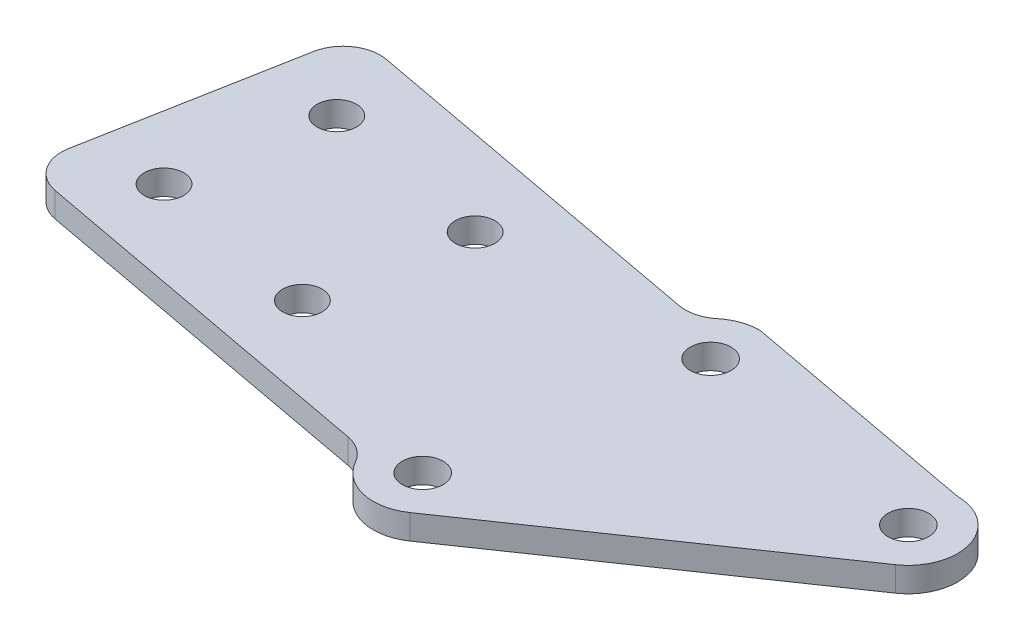
ISO-10303-21;
HEADER;
FILE_DESCRIPTION(('STEP AP214'),'2;1');
FILE_NAME('part.step','',(''),(''),'','','');
FILE_SCHEMA(('AUTOMOTIVE_DESIGN { 1 0 10303 214 1 1 1 1 }'));
ENDSEC;
DATA;
#1=APPLICATION_CONTEXT('core data for automotive mechanical design processes');
#2=APPLICATION_PROTOCOL_DEFINITION('international standard','automotive_design',2000,#1);
#3=PRODUCT_CONTEXT('',#1,'mechanical');
#4=PRODUCT('Part','Part','',(#3));
#5=PRODUCT_RELATED_PRODUCT_CATEGORY('part','',(#4));
#6=PRODUCT_DEFINITION_FORMATION('','',#4);
#7=PRODUCT_DEFINITION_CONTEXT('part definition',#1,'design');
#8=PRODUCT_DEFINITION('design','',#6,#7);
#9=PRODUCT_DEFINITION_SHAPE('','',#8);
#10=(LENGTH_UNIT() NAMED_UNIT(*) SI_UNIT(.MILLI.,.METRE.));
#11=(NAMED_UNIT(*) PLANE_ANGLE_UNIT() SI_UNIT($,.RADIAN.));
#12=(NAMED_UNIT(*) SI_UNIT($,.STERADIAN.) SOLID_ANGLE_UNIT());
#13=UNCERTAINTY_MEASURE_WITH_UNIT(LENGTH_MEASURE(1.E-05),#10,'distance_accuracy_value','');
#14=(GEOMETRIC_REPRESENTATION_CONTEXT(3) GLOBAL_UNCERTAINTY_ASSIGNED_CONTEXT((#13)) GLOBAL_UNIT_ASSIGNED_CONTEXT((#10,
#11,#12)) REPRESENTATION_CONTEXT('',''));
#15=CARTESIAN_POINT('',(0.,0.,0.));
#16=DIRECTION('',(0.,0.,1.));
#17=DIRECTION('',(1.,0.,0.));
#18=AXIS2_PLACEMENT_3D('',#15,#16,#17);
#19=CARTESIAN_POINT('',(-66.4058496105396,1.,-63.3759922013941));
#20=DIRECTION('',(0.,-1.,0.));
#21=DIRECTION('',(0.,0.,-1.));
#22=AXIS2_PLACEMENT_3D('',#19,#20,#21);
#23=PLANE('',#22);
#24=CARTESIAN_POINT('',(-91.0419653587709,1.,-76.6009698482448));
#25=DIRECTION('',(0.,1.,0.));
#26=DIRECTION('',(0.,0.,1.));
#27=AXIS2_PLACEMENT_3D('',#24,#25,#26);
#28=CIRCLE('',#27,1.60000000000001);
#29=CARTESIAN_POINT('',(-91.0419653587709,1.,-75.0009698482448));
#30=VERTEX_POINT('',#29);
#31=EDGE_CURVE('E350',#30,#30,#28,.T.);
#32=ORIENTED_EDGE('',*,*,#31,.F.);
#33=EDGE_LOOP('',(#32));
#34=FACE_BOUND('',#33,.T.);
#35=CARTESIAN_POINT('',(-75.084729666299,1.,-85.8403761633687));
#36=DIRECTION('',(0.,1.,0.));
#37=DIRECTION('',(0.,0.,1.));
#38=AXIS2_PLACEMENT_3D('',#35,#36,#37);
#39=CIRCLE('',#38,1.60000000000001);
#40=CARTESIAN_POINT('',(-75.084729666299,1.,-84.2403761633687));
#41=VERTEX_POINT('',#40);
#42=EDGE_CURVE('E342',#41,#41,#39,.T.);
#43=ORIENTED_EDGE('',*,*,#42,.F.);
#44=EDGE_LOOP('',(#43));
#45=FACE_BOUND('',#44,.T.);
#46=CARTESIAN_POINT('',(-77.2777346038908,1.,-74.0424640877641));
#47=DIRECTION('',(0.,1.,0.));
#48=DIRECTION('',(0.,0.,1.));
#49=AXIS2_PLACEMENT_3D('',#46,#47,#48);
#50=CIRCLE('',#49,1.60000000000001);
#51=CARTESIAN_POINT('',(-77.2777346038908,1.,-72.4424640877641));
#52=VERTEX_POINT('',#51);
#53=EDGE_CURVE('E337',#52,#52,#50,.T.);
#54=ORIENTED_EDGE('',*,*,#53,.F.);
#55=EDGE_LOOP('',(#54));
#56=FACE_BOUND('',#55,.T.);
#57=CARTESIAN_POINT('',(-88.8489604211791,1.,-88.3988819238494));
#58=DIRECTION('',(0.,1.,0.));
#59=DIRECTION('',(0.,0.,1.));
#60=AXIS2_PLACEMENT_3D('',#57,#58,#59);
#61=CIRCLE('',#60,1.60000000000001);
#62=CARTESIAN_POINT('',(-88.8489604211791,1.,-86.7988819238494));
#63=VERTEX_POINT('',#62);
#64=EDGE_CURVE('E349',#63,#63,#61,.T.);
#65=ORIENTED_EDGE('',*,*,#64,.F.);
#66=EDGE_LOOP('',(#65));
#67=FACE_BOUND('',#66,.T.);
#68=CARTESIAN_POINT('',(-66.4058496105396,1.,-63.3759922013941));
#69=DIRECTION('',(0.,-1.,0.));
#70=DIRECTION('',(0.,0.,-1.));
#71=AXIS2_PLACEMENT_3D('',#68,#69,#70);
#72=CIRCLE('',#71,2.99999999999999);
#73=CARTESIAN_POINT('',(-65.8575983761425,1.,-66.3254702202954));
#74=VERTEX_POINT('',#73);
#75=CARTESIAN_POINT('',(-63.7941432603428,1.,-64.852132418426));
#76=VERTEX_POINT('',#75);
#77=EDGE_CURVE('E200',#74,#76,#72,.T.);
#78=ORIENTED_EDGE('',*,*,#77,.T.);
#79=CARTESIAN_POINT('',(-60.311868126746,1.,-66.8203193744716));
#80=DIRECTION('',(0.,1.,0.));
#81=DIRECTION('',(0.,0.,1.));
#82=AXIS2_PLACEMENT_3D('',#79,#80,#81);
#83=CIRCLE('',#82,4.00000000000181);
#84=CARTESIAN_POINT('',(-58.0479698034256,1.,-63.5226286094537));
#85=VERTEX_POINT('',#84);
#86=EDGE_CURVE('E112',#76,#85,#83,.T.);
#87=ORIENTED_EDGE('',*,*,#86,.T.);
#88=DIRECTION('',(0.824422691253763,0.,-0.565974580830183));
#89=VECTOR('',#88,1.);
#90=CARTESIAN_POINT('',(-34.7297747814422,1.,-79.5308071728227));
#91=LINE('',#90,#89);
#92=CARTESIAN_POINT('',(-34.7297747814432,1.,-79.5308071728242));
#93=VERTEX_POINT('',#92);
#94=EDGE_CURVE('E237',#85,#93,#91,.T.);
#95=ORIENTED_EDGE('',*,*,#94,.T.);
#96=CARTESIAN_POINT('',(-36.9936731047651,1.,-82.8284979378391));
#97=DIRECTION('',(0.,1.,0.));
#98=DIRECTION('',(0.,0.,1.));
#99=AXIS2_PLACEMENT_3D('',#96,#97,#98);
#100=CIRCLE('',#99,4.00000000000059);
#101=CARTESIAN_POINT('',(-36.9936731047627,1.,-86.828497937838));
#102=VERTEX_POINT('',#101);
#103=EDGE_CURVE('E257',#93,#102,#100,.T.);
#104=ORIENTED_EDGE('',*,*,#103,.T.);
#105=DIRECTION('',(-0.983159339633897,0.,-0.182750411465037));
#106=VECTOR('',#105,1.);
#107=CARTESIAN_POINT('',(-56.6568598974467,1.,-90.4835061671398));
#108=LINE('',#107,#106);
#109=CARTESIAN_POINT('',(-56.6568598974467,1.,-90.4835061671404));
#110=VERTEX_POINT('',#109);
#111=EDGE_CURVE('E253',#102,#110,#108,.T.);
#112=ORIENTED_EDGE('',*,*,#111,.T.);
#113=CARTESIAN_POINT('',(-56.6568598974491,1.,-86.483506167141));
#114=DIRECTION('',(0.,1.,0.));
#115=DIRECTION('',(0.,0.,1.));
#116=AXIS2_PLACEMENT_3D('',#113,#114,#115);
#117=CIRCLE('',#116,3.99999999999942);
#118=CARTESIAN_POINT('',(-59.199275821622,1.,-89.5715672527596));
#119=VERTEX_POINT('',#118);
#120=EDGE_CURVE('E256',#110,#119,#117,.T.);
#121=ORIENTED_EDGE('',*,*,#120,.T.);
#122=CARTESIAN_POINT('',(-61.1060877647516,1.,-91.8876130669736));
#123=DIRECTION('',(0.,-1.,0.));
#124=DIRECTION('',(0.,0.,-1.));
#125=AXIS2_PLACEMENT_3D('',#122,#123,#124);
#126=CIRCLE('',#125,3.);
#127=CARTESIAN_POINT('',(-61.6543389991496,1.,-88.9381350480725));
#128=VERTEX_POINT('',#127);
#129=EDGE_CURVE('E261',#119,#128,#126,.T.);
#130=ORIENTED_EDGE('',*,*,#129,.T.);
#131=DIRECTION('',(-0.983159339633721,0.,-0.182750411465984));
#132=VECTOR('',#131,1.);
#133=CARTESIAN_POINT('',(-61.6543389991496,1.,-88.9381350480725));
#134=LINE('',#133,#132);
#135=CARTESIAN_POINT('',(-90.7933111770094,1.,-94.3545095262756));
#136=VERTEX_POINT('',#135);
#137=EDGE_CURVE('E268',#128,#136,#134,.T.);
#138=ORIENTED_EDGE('',*,*,#137,.T.);
#139=CARTESIAN_POINT('',(-91.3415624114074,1.,-91.4050315073738));
#140=DIRECTION('',(0.,1.,0.));
#141=DIRECTION('',(0.,0.,1.));
#142=AXIS2_PLACEMENT_3D('',#139,#140,#141);
#143=CIRCLE('',#142,3.00000000000065);
#144=CARTESIAN_POINT('',(-94.2910404303084,1.,-91.953282741773));
#145=VERTEX_POINT('',#144);
#146=EDGE_CURVE('E143',#136,#145,#143,.T.);
#147=ORIENTED_EDGE('',*,*,#146,.T.);
#148=DIRECTION('',(-0.182750411465984,0.,0.983159339633721));
#149=VECTOR('',#148,1.);
#150=CARTESIAN_POINT('',(-94.2910404303084,1.,-91.953282741773));
#151=LINE('',#150,#149);
#152=CARTESIAN_POINT('',(-97.3977974252462,1.,-75.2395739679132));
#153=VERTEX_POINT('',#152);
#154=EDGE_CURVE('E137',#145,#153,#151,.T.);
#155=ORIENTED_EDGE('',*,*,#154,.T.);
#156=CARTESIAN_POINT('',(-94.448319406345,1.,-74.6913227335152));
#157=DIRECTION('',(0.,1.,0.));
#158=DIRECTION('',(0.,0.,-1.));
#159=AXIS2_PLACEMENT_3D('',#156,#157,#158);
#160=CIRCLE('',#159,3.);
#161=CARTESIAN_POINT('',(-94.9965706407421,1.,-71.7418447146139));
#162=VERTEX_POINT('',#161);
#163=EDGE_CURVE('E141',#153,#162,#160,.T.);
#164=ORIENTED_EDGE('',*,*,#163,.T.);
#165=DIRECTION('',(0.983159339633772,0.,0.182750411465706));
#166=VECTOR('',#165,1.);
#167=CARTESIAN_POINT('',(-65.8575983761425,1.,-66.3254702202954));
#168=LINE('',#167,#166);
#169=EDGE_CURVE('E57',#162,#74,#168,.T.);
#170=ORIENTED_EDGE('',*,*,#169,.T.);
#171=EDGE_LOOP('',(#78,#87,#95,#104,#112,#121,#130,#138,#147,#155,#164,#170));
#172=FACE_BOUND('',#171,.T.);
#173=CARTESIAN_POINT('',(-56.6568598974491,1.,-86.483506167141));
#174=DIRECTION('',(0.,1.,0.));
#175=DIRECTION('',(0.,0.,1.));
#176=AXIS2_PLACEMENT_3D('',#173,#174,#175);
#177=CIRCLE('',#176,1.65000000726234);
#178=CARTESIAN_POINT('',(-56.6568598974491,1.,-84.8335061598787));
#179=VERTEX_POINT('',#178);
#180=EDGE_CURVE('E170',#179,#179,#177,.T.);
#181=ORIENTED_EDGE('',*,*,#180,.F.);
#182=EDGE_LOOP('',(#181));
#183=FACE_BOUND('',#182,.T.);
#184=CARTESIAN_POINT('',(-36.9936731047651,1.,-82.8284979378391));
#185=DIRECTION('',(0.,1.,0.));
#186=DIRECTION('',(0.,0.,1.));
#187=AXIS2_PLACEMENT_3D('',#184,#185,#186);
#188=CIRCLE('',#187,1.65000000727592);
#189=CARTESIAN_POINT('',(-36.9936731047651,1.,-81.1784979305632));
#190=VERTEX_POINT('',#189);
#191=EDGE_CURVE('E377',#190,#190,#188,.T.);
#192=ORIENTED_EDGE('',*,*,#191,.F.);
#193=EDGE_LOOP('',(#192));
#194=FACE_BOUND('',#193,.T.);
#195=CARTESIAN_POINT('',(-60.311868126746,1.,-66.8203193744716));
#196=DIRECTION('',(0.,1.,0.));
#197=DIRECTION('',(0.,0.,1.));
#198=AXIS2_PLACEMENT_3D('',#195,#196,#197);
#199=CIRCLE('',#198,1.65000000725749);
#200=CARTESIAN_POINT('',(-60.311868126746,1.,-65.1703193672141));
#201=VERTEX_POINT('',#200);
#202=EDGE_CURVE('E369',#201,#201,#199,.T.);
#203=ORIENTED_EDGE('',*,*,#202,.F.);
#204=EDGE_LOOP('',(#203));
#205=FACE_BOUND('',#204,.T.);
#206=ADVANCED_FACE('F39',(#34,#45,#56,#67,#172,#183,#194,#205),#23,.F.);
#207=CARTESIAN_POINT('',(-66.4058496105396,-1.,-63.3759922013941));
#208=DIRECTION('',(0.,-1.,0.));
#209=DIRECTION('',(0.,0.,-1.));
#210=AXIS2_PLACEMENT_3D('',#207,#208,#209);
#211=PLANE('',#210);
#212=CARTESIAN_POINT('',(-91.0419653587709,-1.,-76.6009698482448));
#213=DIRECTION('',(0.,1.,0.));
#214=DIRECTION('',(0.,0.,1.));
#215=AXIS2_PLACEMENT_3D('',#212,#213,#214);
#216=CIRCLE('',#215,1.60000000000001);
#217=CARTESIAN_POINT('',(-91.0419653587709,-1.,-75.0009698482448));
#218=VERTEX_POINT('',#217);
#219=EDGE_CURVE('E345',#218,#218,#216,.T.);
#220=ORIENTED_EDGE('',*,*,#219,.T.);
#221=EDGE_LOOP('',(#220));
#222=FACE_BOUND('',#221,.T.);
#223=CARTESIAN_POINT('',(-75.084729666299,-1.,-85.8403761633687));
#224=DIRECTION('',(0.,1.,0.));
#225=DIRECTION('',(0.,0.,1.));
#226=AXIS2_PLACEMENT_3D('',#223,#224,#225);
#227=CIRCLE('',#226,1.60000000000001);
#228=CARTESIAN_POINT('',(-75.084729666299,-1.,-84.2403761633687));
#229=VERTEX_POINT('',#228);
#230=EDGE_CURVE('E354',#229,#229,#227,.T.);
#231=ORIENTED_EDGE('',*,*,#230,.T.);
#232=EDGE_LOOP('',(#231));
#233=FACE_BOUND('',#232,.T.);
#234=CARTESIAN_POINT('',(-77.2777346038908,-1.,-74.0424640877641));
#235=DIRECTION('',(0.,1.,0.));
#236=DIRECTION('',(0.,0.,1.));
#237=AXIS2_PLACEMENT_3D('',#234,#235,#236);
#238=CIRCLE('',#237,1.60000000000001);
#239=CARTESIAN_POINT('',(-77.2777346038908,-1.,-72.4424640877641));
#240=VERTEX_POINT('',#239);
#241=EDGE_CURVE('E334',#240,#240,#238,.T.);
#242=ORIENTED_EDGE('',*,*,#241,.T.);
#243=EDGE_LOOP('',(#242));
#244=FACE_BOUND('',#243,.T.);
#245=CARTESIAN_POINT('',(-88.8489604211791,-1.,-88.3988819238494));
#246=DIRECTION('',(0.,1.,0.));
#247=DIRECTION('',(0.,0.,1.));
#248=AXIS2_PLACEMENT_3D('',#245,#246,#247);
#249=CIRCLE('',#248,1.60000000000001);
#250=CARTESIAN_POINT('',(-88.8489604211791,-1.,-86.7988819238494));
#251=VERTEX_POINT('',#250);
#252=EDGE_CURVE('E361',#251,#251,#249,.T.);
#253=ORIENTED_EDGE('',*,*,#252,.T.);
#254=EDGE_LOOP('',(#253));
#255=FACE_BOUND('',#254,.T.);
#256=CARTESIAN_POINT('',(-36.9936731047651,-1.,-82.8284979378391));
#257=DIRECTION('',(0.,1.,0.));
#258=DIRECTION('',(0.,0.,1.));
#259=AXIS2_PLACEMENT_3D('',#256,#257,#258);
#260=CIRCLE('',#259,1.65000000727592);
#261=CARTESIAN_POINT('',(-36.9936731047651,-1.,-81.1784979305632));
#262=VERTEX_POINT('',#261);
#263=EDGE_CURVE('E373',#262,#262,#260,.T.);
#264=ORIENTED_EDGE('',*,*,#263,.T.);
#265=EDGE_LOOP('',(#264));
#266=FACE_BOUND('',#265,.T.);
#267=CARTESIAN_POINT('',(-66.4058496105396,-1.,-63.3759922013941));
#268=DIRECTION('',(0.,-1.,0.));
#269=DIRECTION('',(0.,0.,-1.));
#270=AXIS2_PLACEMENT_3D('',#267,#268,#269);
#271=CIRCLE('',#270,2.99999999999999);
#272=CARTESIAN_POINT('',(-65.8575983761425,-1.,-66.3254702202954));
#273=VERTEX_POINT('',#272);
#274=CARTESIAN_POINT('',(-63.7941432603428,-1.,-64.852132418426));
#275=VERTEX_POINT('',#274);
#276=EDGE_CURVE('E165',#273,#275,#271,.T.);
#277=ORIENTED_EDGE('',*,*,#276,.F.);
#278=DIRECTION('',(0.983159339633772,0.,0.182750411465706));
#279=VECTOR('',#278,1.);
#280=CARTESIAN_POINT('',(-65.8575983761425,-1.,-66.3254702202954));
#281=LINE('',#280,#279);
#282=CARTESIAN_POINT('',(-94.9965706407421,-1.,-71.7418447146139));
#283=VERTEX_POINT('',#282);
#284=EDGE_CURVE('E104',#283,#273,#281,.T.);
#285=ORIENTED_EDGE('',*,*,#284,.F.);
#286=CARTESIAN_POINT('',(-94.448319406345,-1.,-74.6913227335152));
#287=DIRECTION('',(0.,1.,0.));
#288=DIRECTION('',(0.,0.,-1.));
#289=AXIS2_PLACEMENT_3D('',#286,#287,#288);
#290=CIRCLE('',#289,3.);
#291=CARTESIAN_POINT('',(-97.3977974252462,-1.,-75.2395739679132));
#292=VERTEX_POINT('',#291);
#293=EDGE_CURVE('E98',#292,#283,#290,.T.);
#294=ORIENTED_EDGE('',*,*,#293,.F.);
#295=DIRECTION('',(-0.182750411465984,0.,0.983159339633721));
#296=VECTOR('',#295,1.);
#297=CARTESIAN_POINT('',(-94.2910404303084,-1.,-91.953282741773));
#298=LINE('',#297,#296);
#299=CARTESIAN_POINT('',(-94.2910404303084,-1.,-91.953282741773));
#300=VERTEX_POINT('',#299);
#301=EDGE_CURVE('E152',#300,#292,#298,.T.);
#302=ORIENTED_EDGE('',*,*,#301,.F.);
#303=CARTESIAN_POINT('',(-91.3415624114074,-1.,-91.4050315073738));
#304=DIRECTION('',(0.,1.,0.));
#305=DIRECTION('',(0.,0.,1.));
#306=AXIS2_PLACEMENT_3D('',#303,#304,#305);
#307=CIRCLE('',#306,3.00000000000065);
#308=CARTESIAN_POINT('',(-90.7933111770094,-1.,-94.3545095262756));
#309=VERTEX_POINT('',#308);
#310=EDGE_CURVE('E191',#309,#300,#307,.T.);
#311=ORIENTED_EDGE('',*,*,#310,.F.);
#312=DIRECTION('',(-0.983159339633721,0.,-0.182750411465984));
#313=VECTOR('',#312,1.);
#314=CARTESIAN_POINT('',(-61.6543389991496,-1.,-88.9381350480725));
#315=LINE('',#314,#313);
#316=CARTESIAN_POINT('',(-61.6543389991496,-1.,-88.9381350480725));
#317=VERTEX_POINT('',#316);
#318=EDGE_CURVE('E188',#317,#309,#315,.T.);
#319=ORIENTED_EDGE('',*,*,#318,.F.);
#320=CARTESIAN_POINT('',(-61.1060877647516,-1.,-91.8876130669736));
#321=DIRECTION('',(0.,-1.,0.));
#322=DIRECTION('',(0.,0.,-1.));
#323=AXIS2_PLACEMENT_3D('',#320,#321,#322);
#324=CIRCLE('',#323,3.);
#325=CARTESIAN_POINT('',(-59.199275821622,-1.,-89.5715672527596));
#326=VERTEX_POINT('',#325);
#327=EDGE_CURVE('E185',#326,#317,#324,.T.);
#328=ORIENTED_EDGE('',*,*,#327,.F.);
#329=CARTESIAN_POINT('',(-56.6568598974491,-1.,-86.483506167141));
#330=DIRECTION('',(0.,1.,0.));
#331=DIRECTION('',(0.,0.,1.));
#332=AXIS2_PLACEMENT_3D('',#329,#330,#331);
#333=CIRCLE('',#332,3.99999999999942);
#334=CARTESIAN_POINT('',(-56.6568598974467,-1.,-90.4835061671404));
#335=VERTEX_POINT('',#334);
#336=EDGE_CURVE('E182',#335,#326,#333,.T.);
#337=ORIENTED_EDGE('',*,*,#336,.F.);
#338=DIRECTION('',(-0.983159339633897,0.,-0.182750411465037));
#339=VECTOR('',#338,1.);
#340=CARTESIAN_POINT('',(-56.6568598974467,-1.,-90.4835061671398));
#341=LINE('',#340,#339);
#342=CARTESIAN_POINT('',(-36.9936731047627,-1.,-86.828497937838));
#343=VERTEX_POINT('',#342);
#344=EDGE_CURVE('E179',#343,#335,#341,.T.);
#345=ORIENTED_EDGE('',*,*,#344,.F.);
#346=CARTESIAN_POINT('',(-36.9936731047651,-1.,-82.8284979378391));
#347=DIRECTION('',(0.,1.,0.));
#348=DIRECTION('',(0.,0.,1.));
#349=AXIS2_PLACEMENT_3D('',#346,#347,#348);
#350=CIRCLE('',#349,4.00000000000059);
#351=CARTESIAN_POINT('',(-34.7297747814432,-1.,-79.5308071728242));
#352=VERTEX_POINT('',#351);
#353=EDGE_CURVE('E176',#352,#343,#350,.T.);
#354=ORIENTED_EDGE('',*,*,#353,.F.);
#355=DIRECTION('',(0.824422691253763,0.,-0.565974580830183));
#356=VECTOR('',#355,1.);
#357=CARTESIAN_POINT('',(-34.7297747814422,-1.,-79.5308071728227));
#358=LINE('',#357,#356);
#359=CARTESIAN_POINT('',(-58.0479698034256,-1.,-63.5226286094537));
#360=VERTEX_POINT('',#359);
#361=EDGE_CURVE('E173',#360,#352,#358,.T.);
#362=ORIENTED_EDGE('',*,*,#361,.F.);
#363=CARTESIAN_POINT('',(-60.311868126746,-1.,-66.8203193744716));
#364=DIRECTION('',(0.,1.,0.));
#365=DIRECTION('',(0.,0.,1.));
#366=AXIS2_PLACEMENT_3D('',#363,#364,#365);
#367=CIRCLE('',#366,4.00000000000181);
#368=EDGE_CURVE('E169',#275,#360,#367,.T.);
#369=ORIENTED_EDGE('',*,*,#368,.F.);
#370=EDGE_LOOP('',(#277,#285,#294,#302,#311,#319,#328,#337,#345,#354,#362,#369));
#371=FACE_BOUND('',#370,.T.);
#372=CARTESIAN_POINT('',(-56.6568598974491,-1.,-86.483506167141));
#373=DIRECTION('',(0.,1.,0.));
#374=DIRECTION('',(0.,0.,1.));
#375=AXIS2_PLACEMENT_3D('',#372,#373,#374);
#376=CIRCLE('',#375,1.65000000726234);
#377=CARTESIAN_POINT('',(-56.6568598974491,-1.,-84.8335061598787));
#378=VERTEX_POINT('',#377);
#379=EDGE_CURVE('E381',#378,#378,#376,.T.);
#380=ORIENTED_EDGE('',*,*,#379,.T.);
#381=EDGE_LOOP('',(#380));
#382=FACE_BOUND('',#381,.T.);
#383=CARTESIAN_POINT('',(-60.311868126746,-1.,-66.8203193744716));
#384=DIRECTION('',(0.,1.,0.));
#385=DIRECTION('',(0.,0.,1.));
#386=AXIS2_PLACEMENT_3D('',#383,#384,#385);
#387=CIRCLE('',#386,1.65000000725749);
#388=CARTESIAN_POINT('',(-60.311868126746,-1.,-65.1703193672141));
#389=VERTEX_POINT('',#388);
#390=EDGE_CURVE('E365',#389,#389,#387,.T.);
#391=ORIENTED_EDGE('',*,*,#390,.T.);
#392=EDGE_LOOP('',(#391));
#393=FACE_BOUND('',#392,.T.);
#394=ADVANCED_FACE('F241',(#222,#233,#244,#255,#266,#371,#382,#393),#211,.T.);
#395=CARTESIAN_POINT('',(-66.4058496105396,1.,-63.3759922013941));
#396=DIRECTION('',(0.,-1.,0.));
#397=DIRECTION('',(0.,0.,-1.));
#398=AXIS2_PLACEMENT_3D('',#395,#396,#397);
#399=CYLINDRICAL_SURFACE('',#398,2.99999999999999);
#400=ORIENTED_EDGE('',*,*,#276,.T.);
#401=DIRECTION('',(0.,-1.,0.));
#402=VECTOR('',#401,1.);
#403=CARTESIAN_POINT('',(-63.7941432603428,1.,-64.852132418426));
#404=LINE('',#403,#402);
#405=EDGE_CURVE('E11',#76,#275,#404,.T.);
#406=ORIENTED_EDGE('',*,*,#405,.F.);
#407=ORIENTED_EDGE('',*,*,#77,.F.);
#408=DIRECTION('',(0.,-1.,0.));
#409=VECTOR('',#408,1.);
#410=CARTESIAN_POINT('',(-65.8575983761425,1.,-66.3254702202954));
#411=LINE('',#410,#409);
#412=EDGE_CURVE('E161',#74,#273,#411,.T.);
#413=ORIENTED_EDGE('',*,*,#412,.T.);
#414=EDGE_LOOP('',(#400,#406,#407,#413));
#415=FACE_BOUND('',#414,.T.);
#416=ADVANCED_FACE('F41',(#415),#399,.F.);
#417=CARTESIAN_POINT('',(-60.311868126746,1.,-66.8203193744716));
#418=DIRECTION('',(0.,-1.,0.));
#419=DIRECTION('',(0.,0.,-1.));
#420=AXIS2_PLACEMENT_3D('',#417,#418,#419);
#421=CYLINDRICAL_SURFACE('',#420,4.00000000000181);
#422=ORIENTED_EDGE('',*,*,#368,.T.);
#423=DIRECTION('',(0.,-1.,0.));
#424=VECTOR('',#423,1.);
#425=CARTESIAN_POINT('',(-58.0479698034256,1.,-63.5226286094537));
#426=LINE('',#425,#424);
#427=EDGE_CURVE('E49',#85,#360,#426,.T.);
#428=ORIENTED_EDGE('',*,*,#427,.F.);
#429=ORIENTED_EDGE('',*,*,#86,.F.);
#430=ORIENTED_EDGE('',*,*,#405,.T.);
#431=EDGE_LOOP('',(#422,#428,#429,#430));
#432=FACE_BOUND('',#431,.T.);
#433=ADVANCED_FACE('F526',(#432),#421,.T.);
#434=CARTESIAN_POINT('',(-34.7297747814422,1.,-79.5308071728227));
#435=DIRECTION('',(-0.565974580830183,0.,-0.824422691253763));
#436=DIRECTION('',(-0.824422691253763,0.,0.565974580830183));
#437=AXIS2_PLACEMENT_3D('',#434,#435,#436);
#438=PLANE('',#437);
#439=ORIENTED_EDGE('',*,*,#361,.T.);
#440=DIRECTION('',(0.,-1.,0.));
#441=VECTOR('',#440,1.);
#442=CARTESIAN_POINT('',(-34.7297747814432,1.,-79.5308071728242));
#443=LINE('',#442,#441);
#444=EDGE_CURVE('E227',#93,#352,#443,.T.);
#445=ORIENTED_EDGE('',*,*,#444,.F.);
#446=ORIENTED_EDGE('',*,*,#94,.F.);
#447=ORIENTED_EDGE('',*,*,#427,.T.);
#448=EDGE_LOOP('',(#439,#445,#446,#447));
#449=FACE_BOUND('',#448,.T.);
#450=ADVANCED_FACE('F235',(#449),#438,.F.);
#451=CARTESIAN_POINT('',(-36.9936731047651,1.,-82.8284979378391));
#452=DIRECTION('',(0.,-1.,0.));
#453=DIRECTION('',(0.,0.,-1.));
#454=AXIS2_PLACEMENT_3D('',#451,#452,#453);
#455=CYLINDRICAL_SURFACE('',#454,4.00000000000059);
#456=ORIENTED_EDGE('',*,*,#353,.T.);
#457=DIRECTION('',(0.,-1.,0.));
#458=VECTOR('',#457,1.);
#459=CARTESIAN_POINT('',(-36.9936731047627,1.,-86.828497937838));
#460=LINE('',#459,#458);
#461=EDGE_CURVE('E223',#102,#343,#460,.T.);
#462=ORIENTED_EDGE('',*,*,#461,.F.);
#463=ORIENTED_EDGE('',*,*,#103,.F.);
#464=ORIENTED_EDGE('',*,*,#444,.T.);
#465=EDGE_LOOP('',(#456,#462,#463,#464));
#466=FACE_BOUND('',#465,.T.);
#467=ADVANCED_FACE('F247',(#466),#455,.T.);
#468=CARTESIAN_POINT('',(-56.6568598974467,1.,-90.4835061671398));
#469=DIRECTION('',(-0.182750411465037,0.,0.983159339633896));
#470=DIRECTION('',(0.983159339633897,0.,0.182750411465037));
#471=AXIS2_PLACEMENT_3D('',#468,#469,#470);
#472=PLANE('',#471);
#473=ORIENTED_EDGE('',*,*,#344,.T.);
#474=DIRECTION('',(0.,-1.,0.));
#475=VECTOR('',#474,1.);
#476=CARTESIAN_POINT('',(-56.6568598974467,1.,-90.4835061671404));
#477=LINE('',#476,#475);
#478=EDGE_CURVE('E219',#110,#335,#477,.T.);
#479=ORIENTED_EDGE('',*,*,#478,.F.);
#480=ORIENTED_EDGE('',*,*,#111,.F.);
#481=ORIENTED_EDGE('',*,*,#461,.T.);
#482=EDGE_LOOP('',(#473,#479,#480,#481));
#483=FACE_BOUND('',#482,.T.);
#484=ADVANCED_FACE('F251',(#483),#472,.F.);
#485=CARTESIAN_POINT('',(-56.6568598974491,1.,-86.483506167141));
#486=DIRECTION('',(0.,-1.,0.));
#487=DIRECTION('',(0.,0.,-1.));
#488=AXIS2_PLACEMENT_3D('',#485,#486,#487);
#489=CYLINDRICAL_SURFACE('',#488,3.99999999999942);
#490=ORIENTED_EDGE('',*,*,#336,.T.);
#491=DIRECTION('',(0.,-1.,0.));
#492=VECTOR('',#491,1.);
#493=CARTESIAN_POINT('',(-59.199275821622,1.,-89.5715672527596));
#494=LINE('',#493,#492);
#495=EDGE_CURVE('E215',#119,#326,#494,.T.);
#496=ORIENTED_EDGE('',*,*,#495,.F.);
#497=ORIENTED_EDGE('',*,*,#120,.F.);
#498=ORIENTED_EDGE('',*,*,#478,.T.);
#499=EDGE_LOOP('',(#490,#496,#497,#498));
#500=FACE_BOUND('',#499,.T.);
#501=ADVANCED_FACE('F495',(#500),#489,.T.);
#502=CARTESIAN_POINT('',(-61.1060877647516,1.,-91.8876130669736));
#503=DIRECTION('',(0.,-1.,0.));
#504=DIRECTION('',(0.,0.,-1.));
#505=AXIS2_PLACEMENT_3D('',#502,#503,#504);
#506=CYLINDRICAL_SURFACE('',#505,3.);
#507=ORIENTED_EDGE('',*,*,#327,.T.);
#508=DIRECTION('',(0.,-1.,0.));
#509=VECTOR('',#508,1.);
#510=CARTESIAN_POINT('',(-61.6543389991496,1.,-88.9381350480725));
#511=LINE('',#510,#509);
#512=EDGE_CURVE('E211',#128,#317,#511,.T.);
#513=ORIENTED_EDGE('',*,*,#512,.F.);
#514=ORIENTED_EDGE('',*,*,#129,.F.);
#515=ORIENTED_EDGE('',*,*,#495,.T.);
#516=EDGE_LOOP('',(#507,#513,#514,#515));
#517=FACE_BOUND('',#516,.T.);
#518=ADVANCED_FACE('F487',(#517),#506,.F.);
#519=CARTESIAN_POINT('',(-61.6543389991496,1.,-88.9381350480725));
#520=DIRECTION('',(-0.182750411465984,0.,0.983159339633721));
#521=DIRECTION('',(0.983159339633721,0.,0.182750411465984));
#522=AXIS2_PLACEMENT_3D('',#519,#520,#521);
#523=PLANE('',#522);
#524=ORIENTED_EDGE('',*,*,#318,.T.);
#525=DIRECTION('',(0.,-1.,0.));
#526=VECTOR('',#525,1.);
#527=CARTESIAN_POINT('',(-90.7933111770094,1.,-94.3545095262756));
#528=LINE('',#527,#526);
#529=EDGE_CURVE('E207',#136,#309,#528,.T.);
#530=ORIENTED_EDGE('',*,*,#529,.F.);
#531=ORIENTED_EDGE('',*,*,#137,.F.);
#532=ORIENTED_EDGE('',*,*,#512,.T.);
#533=EDGE_LOOP('',(#524,#530,#531,#532));
#534=FACE_BOUND('',#533,.T.);
#535=ADVANCED_FACE('F276',(#534),#523,.F.);
#536=CARTESIAN_POINT('',(-91.3415624114074,1.,-91.4050315073738));
#537=DIRECTION('',(0.,-1.,0.));
#538=DIRECTION('',(0.,0.,-1.));
#539=AXIS2_PLACEMENT_3D('',#536,#537,#538);
#540=CYLINDRICAL_SURFACE('',#539,3.00000000000065);
#541=ORIENTED_EDGE('',*,*,#310,.T.);
#542=DIRECTION('',(0.,-1.,0.));
#543=VECTOR('',#542,1.);
#544=CARTESIAN_POINT('',(-94.2910404303084,1.,-91.953282741773));
#545=LINE('',#544,#543);
#546=EDGE_CURVE('E154',#145,#300,#545,.T.);
#547=ORIENTED_EDGE('',*,*,#546,.F.);
#548=ORIENTED_EDGE('',*,*,#146,.F.);
#549=ORIENTED_EDGE('',*,*,#529,.T.);
#550=EDGE_LOOP('',(#541,#547,#548,#549));
#551=FACE_BOUND('',#550,.T.);
#552=ADVANCED_FACE('F280',(#551),#540,.T.);
#553=CARTESIAN_POINT('',(-94.2910404303084,1.,-91.953282741773));
#554=DIRECTION('',(0.983159339633721,0.,0.182750411465984));
#555=DIRECTION('',(0.182750411465984,0.,-0.983159339633721));
#556=AXIS2_PLACEMENT_3D('',#553,#554,#555);
#557=PLANE('',#556);
#558=ORIENTED_EDGE('',*,*,#301,.T.);
#559=DIRECTION('',(0.,-1.,0.));
#560=VECTOR('',#559,1.);
#561=CARTESIAN_POINT('',(-97.3977974252462,1.,-75.2395739679132));
#562=LINE('',#561,#560);
#563=EDGE_CURVE('E149',#153,#292,#562,.T.);
#564=ORIENTED_EDGE('',*,*,#563,.F.);
#565=ORIENTED_EDGE('',*,*,#154,.F.);
#566=ORIENTED_EDGE('',*,*,#546,.T.);
#567=EDGE_LOOP('',(#558,#564,#565,#566));
#568=FACE_BOUND('',#567,.T.);
#569=ADVANCED_FACE('F150',(#568),#557,.F.);
#570=CARTESIAN_POINT('',(-94.448319406345,1.,-74.6913227335152));
#571=DIRECTION('',(0.,-1.,0.));
#572=DIRECTION('',(0.,0.,-1.));
#573=AXIS2_PLACEMENT_3D('',#570,#571,#572);
#574=CYLINDRICAL_SURFACE('',#573,3.);
#575=ORIENTED_EDGE('',*,*,#293,.T.);
#576=DIRECTION('',(0.,-1.,0.));
#577=VECTOR('',#576,1.);
#578=CARTESIAN_POINT('',(-94.9965706407421,1.,-71.7418447146139));
#579=LINE('',#578,#577);
#580=EDGE_CURVE('E155',#162,#283,#579,.T.);
#581=ORIENTED_EDGE('',*,*,#580,.F.);
#582=ORIENTED_EDGE('',*,*,#163,.F.);
#583=ORIENTED_EDGE('',*,*,#563,.T.);
#584=EDGE_LOOP('',(#575,#581,#582,#583));
#585=FACE_BOUND('',#584,.T.);
#586=ADVANCED_FACE('F157',(#585),#574,.T.);
#587=CARTESIAN_POINT('',(-65.8575983761425,1.,-66.3254702202954));
#588=DIRECTION('',(0.182750411465706,0.,-0.983159339633772));
#589=DIRECTION('',(-0.983159339633772,0.,-0.182750411465706));
#590=AXIS2_PLACEMENT_3D('',#587,#588,#589);
#591=PLANE('',#590);
#592=ORIENTED_EDGE('',*,*,#284,.T.);
#593=ORIENTED_EDGE('',*,*,#412,.F.);
#594=ORIENTED_EDGE('',*,*,#169,.F.);
#595=ORIENTED_EDGE('',*,*,#580,.T.);
#596=EDGE_LOOP('',(#592,#593,#594,#595));
#597=FACE_BOUND('',#596,.T.);
#598=ADVANCED_FACE('F284',(#597),#591,.F.);
#599=CARTESIAN_POINT('',(-56.6568598974491,1.,-86.483506167141));
#600=DIRECTION('',(0.,-1.,0.));
#601=DIRECTION('',(0.,0.,-1.));
#602=AXIS2_PLACEMENT_3D('',#599,#600,#601);
#603=CYLINDRICAL_SURFACE('',#602,1.65000000726234);
#604=ORIENTED_EDGE('',*,*,#180,.T.);
#605=EDGE_LOOP('',(#604));
#606=FACE_BOUND('',#605,.T.);
#607=ORIENTED_EDGE('',*,*,#379,.F.);
#608=EDGE_LOOP('',(#607));
#609=FACE_BOUND('',#608,.T.);
#610=ADVANCED_FACE('F286',(#606,#609),#603,.F.);
#611=CARTESIAN_POINT('',(-36.9936731047651,1.,-82.8284979378391));
#612=DIRECTION('',(0.,-1.,0.));
#613=DIRECTION('',(0.,0.,-1.));
#614=AXIS2_PLACEMENT_3D('',#611,#612,#613);
#615=CYLINDRICAL_SURFACE('',#614,1.65000000727592);
#616=ORIENTED_EDGE('',*,*,#191,.T.);
#617=EDGE_LOOP('',(#616));
#618=FACE_BOUND('',#617,.T.);
#619=ORIENTED_EDGE('',*,*,#263,.F.);
#620=EDGE_LOOP('',(#619));
#621=FACE_BOUND('',#620,.T.);
#622=ADVANCED_FACE('F292',(#618,#621),#615,.F.);
#623=CARTESIAN_POINT('',(-60.311868126746,1.,-66.8203193744716));
#624=DIRECTION('',(0.,-1.,0.));
#625=DIRECTION('',(0.,0.,-1.));
#626=AXIS2_PLACEMENT_3D('',#623,#624,#625);
#627=CYLINDRICAL_SURFACE('',#626,1.65000000725749);
#628=ORIENTED_EDGE('',*,*,#202,.T.);
#629=EDGE_LOOP('',(#628));
#630=FACE_BOUND('',#629,.T.);
#631=ORIENTED_EDGE('',*,*,#390,.F.);
#632=EDGE_LOOP('',(#631));
#633=FACE_BOUND('',#632,.T.);
#634=ADVANCED_FACE('F309',(#630,#633),#627,.F.);
#635=CARTESIAN_POINT('',(-88.8489604211791,-1.,-88.3988819238494));
#636=DIRECTION('',(0.,1.,0.));
#637=DIRECTION('',(0.,0.,1.));
#638=AXIS2_PLACEMENT_3D('',#635,#636,#637);
#639=CYLINDRICAL_SURFACE('',#638,1.60000000000001);
#640=ORIENTED_EDGE('',*,*,#252,.F.);
#641=EDGE_LOOP('',(#640));
#642=FACE_BOUND('',#641,.T.);
#643=ORIENTED_EDGE('',*,*,#64,.T.);
#644=EDGE_LOOP('',(#643));
#645=FACE_BOUND('',#644,.T.);
#646=ADVANCED_FACE('F313',(#642,#645),#639,.F.);
#647=CARTESIAN_POINT('',(-77.2777346038908,-1.,-74.0424640877641));
#648=DIRECTION('',(0.,1.,0.));
#649=DIRECTION('',(0.,0.,1.));
#650=AXIS2_PLACEMENT_3D('',#647,#648,#649);
#651=CYLINDRICAL_SURFACE('',#650,1.60000000000001);
#652=ORIENTED_EDGE('',*,*,#241,.F.);
#653=EDGE_LOOP('',(#652));
#654=FACE_BOUND('',#653,.T.);
#655=ORIENTED_EDGE('',*,*,#53,.T.);
#656=EDGE_LOOP('',(#655));
#657=FACE_BOUND('',#656,.T.);
#658=ADVANCED_FACE('F317',(#654,#657),#651,.F.);
#659=CARTESIAN_POINT('',(-75.084729666299,-1.,-85.8403761633687));
#660=DIRECTION('',(0.,1.,0.));
#661=DIRECTION('',(0.,0.,1.));
#662=AXIS2_PLACEMENT_3D('',#659,#660,#661);
#663=CYLINDRICAL_SURFACE('',#662,1.60000000000001);
#664=ORIENTED_EDGE('',*,*,#230,.F.);
#665=EDGE_LOOP('',(#664));
#666=FACE_BOUND('',#665,.T.);
#667=ORIENTED_EDGE('',*,*,#42,.T.);
#668=EDGE_LOOP('',(#667));
#669=FACE_BOUND('',#668,.T.);
#670=ADVANCED_FACE('F319',(#666,#669),#663,.F.);
#671=CARTESIAN_POINT('',(-91.0419653587709,-1.,-76.6009698482448));
#672=DIRECTION('',(0.,1.,0.));
#673=DIRECTION('',(0.,0.,1.));
#674=AXIS2_PLACEMENT_3D('',#671,#672,#673);
#675=CYLINDRICAL_SURFACE('',#674,1.60000000000001);
#676=ORIENTED_EDGE('',*,*,#219,.F.);
#677=EDGE_LOOP('',(#676));
#678=FACE_BOUND('',#677,.T.);
#679=ORIENTED_EDGE('',*,*,#31,.T.);
#680=EDGE_LOOP('',(#679));
#681=FACE_BOUND('',#680,.T.);
#682=ADVANCED_FACE('F322',(#678,#681),#675,.F.);
#683=CLOSED_SHELL('',(#206,#394,#416,#433,#450,#467,#484,#501,#518,#535,#552,#569,#586,#598,
#610,#622,#634,#646,#658,#670,#682));
#684=MANIFOLD_SOLID_BREP('B2',#683);
#685=ADVANCED_BREP_SHAPE_REPRESENTATION('',(#18,#684),#14);
#686=SHAPE_DEFINITION_REPRESENTATION(#9,#685);
ENDSEC;
END-ISO-10303-21;
